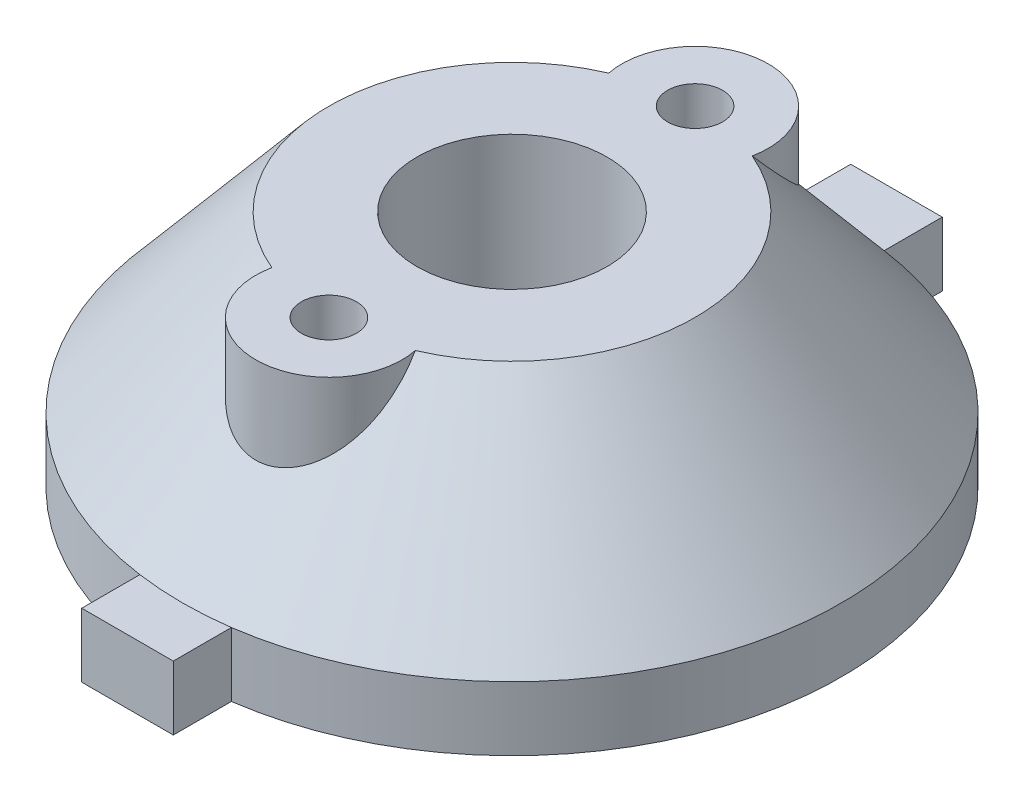
ISO-10303-21;
HEADER;
FILE_DESCRIPTION(('STEP AP214'),'2;1');
FILE_NAME('part.step','',(''),(''),'','','');
FILE_SCHEMA(('AUTOMOTIVE_DESIGN { 1 0 10303 214 1 1 1 1 }'));
ENDSEC;
DATA;
#1=APPLICATION_CONTEXT('core data for automotive mechanical design processes');
#2=APPLICATION_PROTOCOL_DEFINITION('international standard','automotive_design',2000,#1);
#3=PRODUCT_CONTEXT('',#1,'mechanical');
#4=PRODUCT('Part','Part','',(#3));
#5=PRODUCT_RELATED_PRODUCT_CATEGORY('part','',(#4));
#6=PRODUCT_DEFINITION_FORMATION('','',#4);
#7=PRODUCT_DEFINITION_CONTEXT('part definition',#1,'design');
#8=PRODUCT_DEFINITION('design','',#6,#7);
#9=PRODUCT_DEFINITION_SHAPE('','',#8);
#10=(LENGTH_UNIT() NAMED_UNIT(*) SI_UNIT(.MILLI.,.METRE.));
#11=(NAMED_UNIT(*) PLANE_ANGLE_UNIT() SI_UNIT($,.RADIAN.));
#12=(NAMED_UNIT(*) SI_UNIT($,.STERADIAN.) SOLID_ANGLE_UNIT());
#13=UNCERTAINTY_MEASURE_WITH_UNIT(LENGTH_MEASURE(1.E-05),#10,'distance_accuracy_value','');
#14=(GEOMETRIC_REPRESENTATION_CONTEXT(3) GLOBAL_UNCERTAINTY_ASSIGNED_CONTEXT((#13)) GLOBAL_UNIT_ASSIGNED_CONTEXT((#10,
#11,#12)) REPRESENTATION_CONTEXT('',''));
#15=CARTESIAN_POINT('',(0.,0.,0.));
#16=DIRECTION('',(0.,0.,1.));
#17=DIRECTION('',(1.,0.,0.));
#18=AXIS2_PLACEMENT_3D('',#15,#16,#17);
#19=CARTESIAN_POINT('',(0.,0.,0.));
#20=DIRECTION('',(0.,-1.,0.));
#21=DIRECTION('',(0.,0.,-1.));
#22=AXIS2_PLACEMENT_3D('',#19,#20,#21);
#23=CYLINDRICAL_SURFACE('',#22,18.);
#24=DIRECTION('',(0.,-1.,0.));
#25=VECTOR('',#24,1.);
#26=CARTESIAN_POINT('',(-2.5,0.,-17.8255434699759));
#27=LINE('',#26,#25);
#28=CARTESIAN_POINT('',(-2.5,0.,-17.8255434699759));
#29=VERTEX_POINT('',#28);
#30=CARTESIAN_POINT('',(-2.5,3.5,-17.8255434699759));
#31=VERTEX_POINT('',#30);
#32=EDGE_CURVE('E171',#29,#31,#27,.F.);
#33=ORIENTED_EDGE('',*,*,#32,.F.);
#34=CARTESIAN_POINT('',(0.,0.,0.));
#35=DIRECTION('',(0.,-1.,0.));
#36=DIRECTION('',(0.,0.,-1.));
#37=AXIS2_PLACEMENT_3D('',#34,#35,#36);
#38=CIRCLE('',#37,18.);
#39=CARTESIAN_POINT('',(-2.5,0.,17.8255434699759));
#40=VERTEX_POINT('',#39);
#41=EDGE_CURVE('E197',#40,#29,#38,.T.);
#42=ORIENTED_EDGE('',*,*,#41,.F.);
#43=DIRECTION('',(0.,-1.,0.));
#44=VECTOR('',#43,1.);
#45=CARTESIAN_POINT('',(-2.5,0.,17.8255434699759));
#46=LINE('',#45,#44);
#47=CARTESIAN_POINT('',(-2.5,3.5,17.8255434699759));
#48=VERTEX_POINT('',#47);
#49=EDGE_CURVE('E169',#48,#40,#46,.T.);
#50=ORIENTED_EDGE('',*,*,#49,.F.);
#51=CARTESIAN_POINT('',(0.,3.5,0.));
#52=DIRECTION('',(0.,-1.,0.));
#53=DIRECTION('',(0.,0.,-1.));
#54=AXIS2_PLACEMENT_3D('',#51,#52,#53);
#55=CIRCLE('',#54,18.);
#56=EDGE_CURVE('E243',#48,#31,#55,.T.);
#57=ORIENTED_EDGE('',*,*,#56,.T.);
#58=EDGE_LOOP('',(#33,#42,#50,#57));
#59=FACE_BOUND('',#58,.T.);
#60=ADVANCED_FACE('F35',(#59),#23,.T.);
#61=CARTESIAN_POINT('',(0.,13.,0.));
#62=DIRECTION('',(0.,1.,0.));
#63=DIRECTION('',(0.,0.,1.));
#64=AXIS2_PLACEMENT_3D('',#61,#62,#63);
#65=PLANE('',#64);
#66=CARTESIAN_POINT('',(0.,13.,10.));
#67=DIRECTION('',(0.,1.,0.));
#68=DIRECTION('',(0.,0.,-1.));
#69=AXIS2_PLACEMENT_3D('',#66,#67,#68);
#70=CIRCLE('',#69,1.5);
#71=CARTESIAN_POINT('',(0.,13.,8.5));
#72=VERTEX_POINT('',#71);
#73=EDGE_CURVE('E183',#72,#72,#70,.T.);
#74=ORIENTED_EDGE('',*,*,#73,.F.);
#75=EDGE_LOOP('',(#74));
#76=FACE_BOUND('',#75,.T.);
#77=CARTESIAN_POINT('',(0.,13.,-10.));
#78=DIRECTION('',(0.,1.,0.));
#79=DIRECTION('',(0.,0.,1.));
#80=AXIS2_PLACEMENT_3D('',#77,#78,#79);
#81=CIRCLE('',#80,1.5);
#82=CARTESIAN_POINT('',(0.,13.,-8.5));
#83=VERTEX_POINT('',#82);
#84=EDGE_CURVE('E191',#83,#83,#81,.T.);
#85=ORIENTED_EDGE('',*,*,#84,.F.);
#86=EDGE_LOOP('',(#85));
#87=FACE_BOUND('',#86,.T.);
#88=CARTESIAN_POINT('',(0.,13.,0.));
#89=DIRECTION('',(0.,1.,0.));
#90=DIRECTION('',(0.,0.,1.));
#91=AXIS2_PLACEMENT_3D('',#88,#89,#90);
#92=CIRCLE('',#91,5.19238519309489);
#93=CARTESIAN_POINT('',(0.,13.,5.19238519309489));
#94=VERTEX_POINT('',#93);
#95=EDGE_CURVE('E179',#94,#94,#92,.T.);
#96=ORIENTED_EDGE('',*,*,#95,.F.);
#97=EDGE_LOOP('',(#96));
#98=FACE_BOUND('',#97,.T.);
#99=CARTESIAN_POINT('',(0.,13.,0.));
#100=DIRECTION('',(0.,-1.,0.));
#101=DIRECTION('',(0.,0.,-1.));
#102=AXIS2_PLACEMENT_3D('',#99,#100,#101);
#103=CIRCLE('',#102,10.);
#104=CARTESIAN_POINT('',(-3.91918358845308,13.,9.2));
#105=VERTEX_POINT('',#104);
#106=CARTESIAN_POINT('',(-3.91918358845308,13.,-9.2));
#107=VERTEX_POINT('',#106);
#108=EDGE_CURVE('E203',#105,#107,#103,.T.);
#109=ORIENTED_EDGE('',*,*,#108,.F.);
#110=CARTESIAN_POINT('',(0.,13.,10.));
#111=DIRECTION('',(0.,1.,0.));
#112=DIRECTION('',(0.,0.,-1.));
#113=AXIS2_PLACEMENT_3D('',#110,#111,#112);
#114=CIRCLE('',#113,4.);
#115=CARTESIAN_POINT('',(3.91918358845308,13.,9.2));
#116=VERTEX_POINT('',#115);
#117=EDGE_CURVE('E188',#105,#116,#114,.T.);
#118=ORIENTED_EDGE('',*,*,#117,.T.);
#119=CARTESIAN_POINT('',(3.91918358845308,13.,-9.2));
#120=VERTEX_POINT('',#119);
#121=EDGE_CURVE('E205',#120,#116,#103,.T.);
#122=ORIENTED_EDGE('',*,*,#121,.F.);
#123=CARTESIAN_POINT('',(0.,13.,-10.));
#124=DIRECTION('',(0.,1.,0.));
#125=DIRECTION('',(0.,0.,1.));
#126=AXIS2_PLACEMENT_3D('',#123,#124,#125);
#127=CIRCLE('',#126,4.);
#128=EDGE_CURVE('E194',#120,#107,#127,.T.);
#129=ORIENTED_EDGE('',*,*,#128,.T.);
#130=EDGE_LOOP('',(#109,#118,#122,#129));
#131=FACE_BOUND('',#130,.T.);
#132=ADVANCED_FACE('F37',(#76,#87,#98,#131),#65,.T.);
#133=CARTESIAN_POINT('',(0.,3.5,0.));
#134=DIRECTION('',(0.,-1.,0.));
#135=DIRECTION('',(0.,0.,-1.));
#136=AXIS2_PLACEMENT_3D('',#133,#134,#135);
#137=CONICAL_SURFACE('',#136,18.,0.699892869719244);
#138=CARTESIAN_POINT('',(-3.91914920616961,13.0002,9.19983158036566));
#139=CARTESIAN_POINT('',(-3.95075923455144,12.8160826917739,9.35484774935974));
#140=CARTESIAN_POINT('',(-3.97346461662511,12.6328062628066,9.51281594223678));
#141=CARTESIAN_POINT('',(-3.99980240402056,12.268589800989,9.8337213347549));
#142=CARTESIAN_POINT('',(-4.00339458043925,12.0876554950604,9.99666828963129));
#143=CARTESIAN_POINT('',(-3.9900281867457,11.7276733584543,10.3276692278454));
#144=CARTESIAN_POINT('',(-3.97285250875532,11.5486655402407,10.4957589456478));
#145=CARTESIAN_POINT('',(-3.91595365293676,11.1960212987407,10.833427783479));
#146=CARTESIAN_POINT('',(-3.87625259219583,11.0223797825077,11.0030052821346));
#147=CARTESIAN_POINT('',(-3.75662698397835,10.6299465777407,11.393256192884));
#148=CARTESIAN_POINT('',(-3.66813748206792,10.4134991795126,11.6137715577348));
#149=CARTESIAN_POINT('',(-3.44541916363908,9.99757485410138,12.0464624718719));
#150=CARTESIAN_POINT('',(-3.31136302415467,9.7980373611375,12.2586661815325));
#151=CARTESIAN_POINT('',(-3.02853819048656,9.46352339642307,12.620771034298));
#152=CARTESIAN_POINT('',(-2.8895483314789,9.32401814645826,12.7740853390518));
#153=CARTESIAN_POINT('',(-2.58013517936633,9.06336515950528,13.0639419331389));
#154=CARTESIAN_POINT('',(-2.40973894899039,8.94220177989101,13.200498495057));
#155=CARTESIAN_POINT('',(-2.07454496334474,8.74512430661364,13.4246915020768));
#156=CARTESIAN_POINT('',(-1.91518451074698,8.66499555299191,13.5166711830348));
#157=CARTESIAN_POINT('',(-1.66283984130523,8.55887155890463,13.6391949229873));
#158=CARTESIAN_POINT('',(-1.57647741312468,8.5258333092794,13.6774717909999));
#159=CARTESIAN_POINT('',(-1.39972331379381,8.46484768833547,13.7483095984875));
#160=CARTESIAN_POINT('',(-1.30933342794783,8.43689808870681,13.7808730396332));
#161=CARTESIAN_POINT('',(-1.12433170041257,8.38627737591535,13.8399717058878));
#162=CARTESIAN_POINT('',(-1.02969247020207,8.36364904722242,13.8664580306094));
#163=CARTESIAN_POINT('',(-0.837594625726707,8.32431590690684,13.9125675450234));
#164=CARTESIAN_POINT('',(-0.740137421411839,8.30760818658521,13.9321941047421));
#165=CARTESIAN_POINT('',(-0.543211906859828,8.28038962123624,13.9641983952071));
#166=CARTESIAN_POINT('',(-0.443744176656824,8.26987701459124,13.9765781866087));
#167=CARTESIAN_POINT('',(-0.243698083298808,8.25523178790699,13.9938310337544));
#168=CARTESIAN_POINT('',(-0.143119857256524,8.25109838890706,13.9987050060287));
#169=CARTESIAN_POINT('',(0.04603418073018,8.24939357231949,14.0007149938418));
#170=CARTESIAN_POINT('',(0.134596089028336,8.25109155696998,13.9987125403984));
#171=CARTESIAN_POINT('',(0.311186837690387,8.25945325524702,13.988857652276));
#172=CARTESIAN_POINT('',(0.399215502085891,8.26611852670707,13.9810033823589));
#173=CARTESIAN_POINT('',(0.57402092085884,8.28432061628312,13.9595766260944));
#174=CARTESIAN_POINT('',(0.660798272800297,8.29585502370492,13.9460069694249));
#175=CARTESIAN_POINT('',(0.832558671879409,8.32363389374952,13.9133750067335));
#176=CARTESIAN_POINT('',(0.917541017113281,8.33988016357242,13.8943105932556));
#177=CARTESIAN_POINT('',(1.16620882074751,8.39478998427296,13.8299960149364));
#178=CARTESIAN_POINT('',(1.32661926532747,8.43994827875488,13.7772405403781));
#179=CARTESIAN_POINT('',(1.63502963220609,8.54572622223374,13.6543565862017));
#180=CARTESIAN_POINT('',(1.78302648348076,8.60634968228599,13.5842238244499));
#181=CARTESIAN_POINT('',(2.08075253095367,8.74852063654434,13.4208841812101));
#182=CARTESIAN_POINT('',(2.22877605310944,8.83166108790051,13.3259628080941));
#183=CARTESIAN_POINT('',(2.50591999157956,9.01150544875719,13.1224985169739));
#184=CARTESIAN_POINT('',(2.63502736061572,9.10821863076582,13.0139462921359));
#185=CARTESIAN_POINT('',(2.93721690280013,9.36661033490924,12.7269252504796));
#186=CARTESIAN_POINT('',(3.09765856952296,9.53568223783478,12.5417383865915));
#187=CARTESIAN_POINT('',(3.3762770383753,9.89252977024584,12.158065732057));
#188=CARTESIAN_POINT('',(3.49435807617712,10.0803465671418,11.959550998052));
#189=CARTESIAN_POINT('',(3.72627889162501,10.5382042244586,11.4855342634266));
#190=CARTESIAN_POINT('',(3.82397458280074,10.8139049934442,11.2075442121197));
#191=CARTESIAN_POINT('',(3.92337564777988,11.2390544236992,10.7921288595299));
#192=CARTESIAN_POINT('',(3.94865392424535,11.3828589608977,10.6537761792969));
#193=CARTESIAN_POINT('',(3.98446244218456,11.6736725916697,10.3785342068061));
#194=CARTESIAN_POINT('',(3.99499699778404,11.8206807350517,10.2416444981107));
#195=CARTESIAN_POINT('',(4.00271490460542,12.138576810716,9.9507002130268));
#196=CARTESIAN_POINT('',(3.99775364180485,12.3098510141355,9.79701733185192));
#197=CARTESIAN_POINT('',(3.97082560162892,12.6539094879056,9.494642178619));
#198=CARTESIAN_POINT('',(3.94894541501581,12.8266816529043,9.34592850524946));
#199=CARTESIAN_POINT('',(3.91914920616961,13.0002,9.19983158036566));
#200=B_SPLINE_CURVE_WITH_KNOTS('',3,(#138,#139,#140,#141,#142,#143,#144,#145,#146,#147,#148,
#149,#150,#151,#152,#153,#154,#155,#156,#157,#158,#159,#160,#161,#162,#163,#164,#165,#166,#167,
#168,#169,#170,#171,#172,#173,#174,#175,#176,#177,#178,#179,#180,#181,#182,#183,#184,#185,#186,
#187,#188,#189,#190,#191,#192,#193,#194,#195,#196,#197,#198,#199),.UNSPECIFIED.,.F.,.F.,(4,2,2,
2,2,2,2,2,2,2,2,2,2,2,2,2,2,2,2,2,2,2,2,2,2,2,2,2,2,2,4),(0.,0.728201494021865,1.4579350802022,
2.19536373594051,2.93206957960081,3.8930103246706,4.85034940115872,5.59637650600973,
6.34176374282988,6.94119324865365,7.2411028392019,7.54088078238313,7.84299236741608,
8.14495532347626,8.44683237307827,8.74867255776329,9.01414658652434,9.27970390793202,
9.54512990664379,9.81065784247409,10.3326871179678,10.8548451607556,11.4361986600401,
12.0179512747857,12.906024391355,13.7960927005026,14.9996733189436,15.6027144296298,
16.2055790489464,16.8953884653647,17.5816906281441),.UNSPECIFIED.);
#201=EDGE_CURVE('E11',#105,#116,#200,.T.);
#202=ORIENTED_EDGE('',*,*,#201,.F.);
#203=ORIENTED_EDGE('',*,*,#108,.T.);
#204=CARTESIAN_POINT('',(3.91914920616961,13.0002,-9.19983158036566));
#205=CARTESIAN_POINT('',(3.95075923455144,12.8160826917739,-9.35484774935974));
#206=CARTESIAN_POINT('',(3.97346461662511,12.6328062628066,-9.51281594223678));
#207=CARTESIAN_POINT('',(3.99980240402056,12.268589800989,-9.8337213347549));
#208=CARTESIAN_POINT('',(4.00339458043925,12.0876554950604,-9.99666828963129));
#209=CARTESIAN_POINT('',(3.9900281867457,11.7276733584543,-10.3276692278454));
#210=CARTESIAN_POINT('',(3.97285250875532,11.5486655402407,-10.4957589456478));
#211=CARTESIAN_POINT('',(3.91595365293676,11.1960212987407,-10.833427783479));
#212=CARTESIAN_POINT('',(3.87625259219583,11.0223797825077,-11.0030052821346));
#213=CARTESIAN_POINT('',(3.75662698397835,10.6299465777407,-11.393256192884));
#214=CARTESIAN_POINT('',(3.66813748206792,10.4134991795126,-11.6137715577348));
#215=CARTESIAN_POINT('',(3.44541916363908,9.99757485410138,-12.0464624718719));
#216=CARTESIAN_POINT('',(3.31136302415467,9.7980373611375,-12.2586661815325));
#217=CARTESIAN_POINT('',(3.02853819048656,9.46352339642307,-12.620771034298));
#218=CARTESIAN_POINT('',(2.8895483314789,9.32401814645826,-12.7740853390518));
#219=CARTESIAN_POINT('',(2.58013517936633,9.06336515950528,-13.0639419331389));
#220=CARTESIAN_POINT('',(2.40973894899039,8.94220177989101,-13.200498495057));
#221=CARTESIAN_POINT('',(2.07454496334474,8.74512430661364,-13.4246915020768));
#222=CARTESIAN_POINT('',(1.91518451074698,8.66499555299191,-13.5166711830348));
#223=CARTESIAN_POINT('',(1.66283984130523,8.55887155890463,-13.6391949229873));
#224=CARTESIAN_POINT('',(1.57647741312468,8.5258333092794,-13.6774717909999));
#225=CARTESIAN_POINT('',(1.39972331379381,8.46484768833547,-13.7483095984875));
#226=CARTESIAN_POINT('',(1.30933342794783,8.43689808870681,-13.7808730396332));
#227=CARTESIAN_POINT('',(1.12433170041257,8.38627737591535,-13.8399717058878));
#228=CARTESIAN_POINT('',(1.02969247020207,8.36364904722242,-13.8664580306094));
#229=CARTESIAN_POINT('',(0.837594625726707,8.32431590690684,-13.9125675450234));
#230=CARTESIAN_POINT('',(0.740137421411839,8.30760818658521,-13.9321941047421));
#231=CARTESIAN_POINT('',(0.543211906859828,8.28038962123624,-13.9641983952071));
#232=CARTESIAN_POINT('',(0.443744176656824,8.26987701459124,-13.9765781866087));
#233=CARTESIAN_POINT('',(0.243698083298808,8.25523178790699,-13.9938310337544));
#234=CARTESIAN_POINT('',(0.143119857256524,8.25109838890706,-13.9987050060287));
#235=CARTESIAN_POINT('',(-0.04603418073018,8.24939357231949,-14.0007149938418));
#236=CARTESIAN_POINT('',(-0.134596089028336,8.25109155696998,-13.9987125403984));
#237=CARTESIAN_POINT('',(-0.311186837690387,8.25945325524702,-13.988857652276));
#238=CARTESIAN_POINT('',(-0.399215502085891,8.26611852670707,-13.9810033823589));
#239=CARTESIAN_POINT('',(-0.57402092085884,8.28432061628312,-13.9595766260944));
#240=CARTESIAN_POINT('',(-0.660798272800297,8.29585502370492,-13.9460069694249));
#241=CARTESIAN_POINT('',(-0.832558671879409,8.32363389374952,-13.9133750067335));
#242=CARTESIAN_POINT('',(-0.917541017113281,8.33988016357242,-13.8943105932556));
#243=CARTESIAN_POINT('',(-1.16620882074751,8.39478998427296,-13.8299960149364));
#244=CARTESIAN_POINT('',(-1.32661926532747,8.43994827875488,-13.7772405403781));
#245=CARTESIAN_POINT('',(-1.63502963220609,8.54572622223374,-13.6543565862017));
#246=CARTESIAN_POINT('',(-1.78302648348076,8.60634968228599,-13.5842238244499));
#247=CARTESIAN_POINT('',(-2.08075253095367,8.74852063654434,-13.4208841812101));
#248=CARTESIAN_POINT('',(-2.22877605310944,8.83166108790051,-13.3259628080941));
#249=CARTESIAN_POINT('',(-2.50591999157956,9.01150544875719,-13.1224985169739));
#250=CARTESIAN_POINT('',(-2.63502736061572,9.10821863076582,-13.0139462921359));
#251=CARTESIAN_POINT('',(-2.93721690280013,9.36661033490924,-12.7269252504796));
#252=CARTESIAN_POINT('',(-3.09765856952296,9.53568223783478,-12.5417383865915));
#253=CARTESIAN_POINT('',(-3.3762770383753,9.89252977024584,-12.158065732057));
#254=CARTESIAN_POINT('',(-3.49435807617712,10.0803465671418,-11.959550998052));
#255=CARTESIAN_POINT('',(-3.72627889162501,10.5382042244586,-11.4855342634266));
#256=CARTESIAN_POINT('',(-3.82397458280074,10.8139049934442,-11.2075442121197));
#257=CARTESIAN_POINT('',(-3.92337564777988,11.2390544236992,-10.7921288595299));
#258=CARTESIAN_POINT('',(-3.94865392424535,11.3828589608977,-10.6537761792969));
#259=CARTESIAN_POINT('',(-3.98446244218456,11.6736725916697,-10.3785342068061));
#260=CARTESIAN_POINT('',(-3.99499699778404,11.8206807350517,-10.2416444981107));
#261=CARTESIAN_POINT('',(-4.00271490460542,12.138576810716,-9.9507002130268));
#262=CARTESIAN_POINT('',(-3.99775364180485,12.3098510141355,-9.79701733185192));
#263=CARTESIAN_POINT('',(-3.97082560162892,12.6539094879056,-9.494642178619));
#264=CARTESIAN_POINT('',(-3.94894541501581,12.8266816529043,-9.34592850524946));
#265=CARTESIAN_POINT('',(-3.91914920616961,13.0002,-9.19983158036566));
#266=B_SPLINE_CURVE_WITH_KNOTS('',3,(#204,#205,#206,#207,#208,#209,#210,#211,#212,#213,#214,
#215,#216,#217,#218,#219,#220,#221,#222,#223,#224,#225,#226,#227,#228,#229,#230,#231,#232,#233,
#234,#235,#236,#237,#238,#239,#240,#241,#242,#243,#244,#245,#246,#247,#248,#249,#250,#251,#252,
#253,#254,#255,#256,#257,#258,#259,#260,#261,#262,#263,#264,#265),.UNSPECIFIED.,.F.,.F.,(4,2,2,
2,2,2,2,2,2,2,2,2,2,2,2,2,2,2,2,2,2,2,2,2,2,2,2,2,2,2,4),(0.,0.728201494021865,1.4579350802022,
2.19536373594051,2.93206957960081,3.8930103246706,4.85034940115872,5.59637650600973,
6.34176374282988,6.94119324865365,7.2411028392019,7.54088078238313,7.84299236741608,
8.14495532347626,8.44683237307827,8.74867255776329,9.01414658652434,9.27970390793202,
9.54512990664379,9.81065784247409,10.3326871179678,10.8548451607556,11.4361986600401,
12.0179512747857,12.906024391355,13.7960927005026,14.9996733189436,15.6027144296298,
16.2055790489464,16.8953884653647,17.5816906281441),.UNSPECIFIED.);
#267=EDGE_CURVE('E47',#120,#107,#266,.T.);
#268=ORIENTED_EDGE('',*,*,#267,.F.);
#269=ORIENTED_EDGE('',*,*,#121,.T.);
#270=EDGE_LOOP('',(#202,#203,#268,#269));
#271=FACE_BOUND('',#270,.T.);
#272=CARTESIAN_POINT('',(2.5,3.5,-17.8255434699759));
#273=VERTEX_POINT('',#272);
#274=CARTESIAN_POINT('',(2.5,3.5,17.8255434699759));
#275=VERTEX_POINT('',#274);
#276=EDGE_CURVE('E200',#273,#275,#55,.T.);
#277=ORIENTED_EDGE('',*,*,#276,.F.);
#278=EDGE_CURVE('E134',#31,#273,#55,.T.);
#279=ORIENTED_EDGE('',*,*,#278,.F.);
#280=ORIENTED_EDGE('',*,*,#56,.F.);
#281=EDGE_CURVE('E204',#275,#48,#55,.T.);
#282=ORIENTED_EDGE('',*,*,#281,.F.);
#283=EDGE_LOOP('',(#277,#279,#280,#282));
#284=FACE_BOUND('',#283,.T.);
#285=ADVANCED_FACE('F211',(#271,#284),#137,.T.);
#286=DIRECTION('',(0.,-1.,0.));
#287=VECTOR('',#286,1.);
#288=CARTESIAN_POINT('',(2.5,0.,17.8255434699759));
#289=LINE('',#288,#287);
#290=CARTESIAN_POINT('',(2.5,0.,17.8255434699759));
#291=VERTEX_POINT('',#290);
#292=EDGE_CURVE('E167',#291,#275,#289,.F.);
#293=ORIENTED_EDGE('',*,*,#292,.F.);
#294=CARTESIAN_POINT('',(2.5,0.,-17.8255434699759));
#295=VERTEX_POINT('',#294);
#296=EDGE_CURVE('E198',#295,#291,#38,.T.);
#297=ORIENTED_EDGE('',*,*,#296,.F.);
#298=DIRECTION('',(0.,-1.,0.));
#299=VECTOR('',#298,1.);
#300=CARTESIAN_POINT('',(2.5,0.,-17.8255434699759));
#301=LINE('',#300,#299);
#302=EDGE_CURVE('E161',#273,#295,#301,.T.);
#303=ORIENTED_EDGE('',*,*,#302,.F.);
#304=ORIENTED_EDGE('',*,*,#276,.T.);
#305=EDGE_LOOP('',(#293,#297,#303,#304));
#306=FACE_BOUND('',#305,.T.);
#307=ADVANCED_FACE('F223',(#306),#23,.T.);
#308=CARTESIAN_POINT('',(0.,0.,0.));
#309=DIRECTION('',(0.,-1.,0.));
#310=DIRECTION('',(0.,0.,-1.));
#311=AXIS2_PLACEMENT_3D('',#308,#309,#310);
#312=PLANE('',#311);
#313=CARTESIAN_POINT('',(0.,0.,0.));
#314=DIRECTION('',(0.,-1.,0.));
#315=DIRECTION('',(0.,0.,-1.));
#316=AXIS2_PLACEMENT_3D('',#313,#314,#315);
#317=CIRCLE('',#316,1.5);
#318=CARTESIAN_POINT('',(0.,0.,-1.5));
#319=VERTEX_POINT('',#318);
#320=EDGE_CURVE('E146',#319,#319,#317,.T.);
#321=ORIENTED_EDGE('',*,*,#320,.F.);
#322=EDGE_LOOP('',(#321));
#323=FACE_BOUND('',#322,.T.);
#324=ORIENTED_EDGE('',*,*,#296,.T.);
#325=DIRECTION('',(0.,0.,1.));
#326=VECTOR('',#325,1.);
#327=CARTESIAN_POINT('',(2.5,0.,-21.));
#328=LINE('',#327,#326);
#329=CARTESIAN_POINT('',(2.5,0.,21.));
#330=VERTEX_POINT('',#329);
#331=EDGE_CURVE('E156',#291,#330,#328,.T.);
#332=ORIENTED_EDGE('',*,*,#331,.T.);
#333=DIRECTION('',(-1.,0.,0.));
#334=VECTOR('',#333,1.);
#335=CARTESIAN_POINT('',(-2.5,0.,21.));
#336=LINE('',#335,#334);
#337=CARTESIAN_POINT('',(-2.5,0.,21.));
#338=VERTEX_POINT('',#337);
#339=EDGE_CURVE('E158',#330,#338,#336,.T.);
#340=ORIENTED_EDGE('',*,*,#339,.T.);
#341=DIRECTION('',(0.,0.,-1.));
#342=VECTOR('',#341,1.);
#343=CARTESIAN_POINT('',(-2.5,0.,-21.));
#344=LINE('',#343,#342);
#345=EDGE_CURVE('E54',#338,#40,#344,.T.);
#346=ORIENTED_EDGE('',*,*,#345,.T.);
#347=ORIENTED_EDGE('',*,*,#41,.T.);
#348=CARTESIAN_POINT('',(-2.5,0.,-21.));
#349=VERTEX_POINT('',#348);
#350=EDGE_CURVE('E143',#29,#349,#344,.T.);
#351=ORIENTED_EDGE('',*,*,#350,.T.);
#352=DIRECTION('',(1.,0.,0.));
#353=VECTOR('',#352,1.);
#354=CARTESIAN_POINT('',(-2.5,0.,-21.));
#355=LINE('',#354,#353);
#356=CARTESIAN_POINT('',(2.5,0.,-21.));
#357=VERTEX_POINT('',#356);
#358=EDGE_CURVE('E154',#349,#357,#355,.T.);
#359=ORIENTED_EDGE('',*,*,#358,.T.);
#360=EDGE_CURVE('E61',#357,#295,#328,.T.);
#361=ORIENTED_EDGE('',*,*,#360,.T.);
#362=EDGE_LOOP('',(#324,#332,#340,#346,#347,#351,#359,#361));
#363=FACE_BOUND('',#362,.T.);
#364=ADVANCED_FACE('F220',(#323,#363),#312,.T.);
#365=CARTESIAN_POINT('',(0.,3.,-10.));
#366=DIRECTION('',(0.,1.,0.));
#367=DIRECTION('',(0.,0.,1.));
#368=AXIS2_PLACEMENT_3D('',#365,#366,#367);
#369=CYLINDRICAL_SURFACE('',#368,4.);
#370=ORIENTED_EDGE('',*,*,#128,.F.);
#371=ORIENTED_EDGE('',*,*,#267,.T.);
#372=EDGE_LOOP('',(#370,#371));
#373=FACE_BOUND('',#372,.T.);
#374=ADVANCED_FACE('F214',(#373),#369,.T.);
#375=CARTESIAN_POINT('',(0.,3.,-10.));
#376=DIRECTION('',(0.,1.,0.));
#377=DIRECTION('',(0.,0.,1.));
#378=AXIS2_PLACEMENT_3D('',#375,#376,#377);
#379=CYLINDRICAL_SURFACE('',#378,1.5);
#380=ORIENTED_EDGE('',*,*,#84,.T.);
#381=EDGE_LOOP('',(#380));
#382=FACE_BOUND('',#381,.T.);
#383=CARTESIAN_POINT('',(0.,5.,-10.));
#384=DIRECTION('',(0.,1.,0.));
#385=DIRECTION('',(0.,0.,1.));
#386=AXIS2_PLACEMENT_3D('',#383,#384,#385);
#387=CIRCLE('',#386,1.5);
#388=CARTESIAN_POINT('',(0.,5.,-8.5));
#389=VERTEX_POINT('',#388);
#390=EDGE_CURVE('E176',#389,#389,#387,.T.);
#391=ORIENTED_EDGE('',*,*,#390,.F.);
#392=EDGE_LOOP('',(#391));
#393=FACE_BOUND('',#392,.T.);
#394=ADVANCED_FACE('F219',(#382,#393),#379,.F.);
#395=CARTESIAN_POINT('',(0.,3.,10.));
#396=DIRECTION('',(0.,1.,0.));
#397=DIRECTION('',(0.,0.,1.));
#398=AXIS2_PLACEMENT_3D('',#395,#396,#397);
#399=CYLINDRICAL_SURFACE('',#398,4.);
#400=ORIENTED_EDGE('',*,*,#117,.F.);
#401=ORIENTED_EDGE('',*,*,#201,.T.);
#402=EDGE_LOOP('',(#400,#401));
#403=FACE_BOUND('',#402,.T.);
#404=ADVANCED_FACE('F319',(#403),#399,.T.);
#405=CARTESIAN_POINT('',(0.,3.,10.));
#406=DIRECTION('',(0.,1.,0.));
#407=DIRECTION('',(0.,0.,1.));
#408=AXIS2_PLACEMENT_3D('',#405,#406,#407);
#409=CYLINDRICAL_SURFACE('',#408,1.5);
#410=ORIENTED_EDGE('',*,*,#73,.T.);
#411=EDGE_LOOP('',(#410));
#412=FACE_BOUND('',#411,.T.);
#413=CARTESIAN_POINT('',(0.,5.,10.));
#414=DIRECTION('',(0.,1.,0.));
#415=DIRECTION('',(0.,0.,1.));
#416=AXIS2_PLACEMENT_3D('',#413,#414,#415);
#417=CIRCLE('',#416,1.5);
#418=CARTESIAN_POINT('',(0.,5.,11.5));
#419=VERTEX_POINT('',#418);
#420=EDGE_CURVE('E173',#419,#419,#417,.T.);
#421=ORIENTED_EDGE('',*,*,#420,.F.);
#422=EDGE_LOOP('',(#421));
#423=FACE_BOUND('',#422,.T.);
#424=ADVANCED_FACE('F308',(#412,#423),#409,.F.);
#425=CARTESIAN_POINT('',(0.,5.,0.));
#426=DIRECTION('',(0.,1.,0.));
#427=DIRECTION('',(0.,0.,1.));
#428=AXIS2_PLACEMENT_3D('',#425,#426,#427);
#429=CYLINDRICAL_SURFACE('',#428,5.19238519309489);
#430=CARTESIAN_POINT('',(0.,5.,0.));
#431=DIRECTION('',(0.,1.,0.));
#432=DIRECTION('',(0.,0.,1.));
#433=AXIS2_PLACEMENT_3D('',#430,#431,#432);
#434=CIRCLE('',#433,5.19238519309489);
#435=CARTESIAN_POINT('',(0.,5.,5.19238519309489));
#436=VERTEX_POINT('',#435);
#437=EDGE_CURVE('E180',#436,#436,#434,.T.);
#438=ORIENTED_EDGE('',*,*,#437,.F.);
#439=EDGE_LOOP('',(#438));
#440=FACE_BOUND('',#439,.T.);
#441=ORIENTED_EDGE('',*,*,#95,.T.);
#442=EDGE_LOOP('',(#441));
#443=FACE_BOUND('',#442,.T.);
#444=ADVANCED_FACE('F302',(#440,#443),#429,.F.);
#445=CARTESIAN_POINT('',(0.,5.,0.));
#446=DIRECTION('',(0.,1.,0.));
#447=DIRECTION('',(0.,0.,1.));
#448=AXIS2_PLACEMENT_3D('',#445,#446,#447);
#449=PLANE('',#448);
#450=CARTESIAN_POINT('',(0.,5.,0.));
#451=DIRECTION('',(0.,1.,0.));
#452=DIRECTION('',(0.,0.,1.));
#453=AXIS2_PLACEMENT_3D('',#450,#451,#452);
#454=CIRCLE('',#453,1.5);
#455=CARTESIAN_POINT('',(0.,5.,1.5));
#456=VERTEX_POINT('',#455);
#457=EDGE_CURVE('E296',#456,#456,#454,.T.);
#458=ORIENTED_EDGE('',*,*,#457,.F.);
#459=EDGE_LOOP('',(#458));
#460=FACE_BOUND('',#459,.T.);
#461=ORIENTED_EDGE('',*,*,#437,.T.);
#462=EDGE_LOOP('',(#461));
#463=FACE_BOUND('',#462,.T.);
#464=ADVANCED_FACE('F298',(#460,#463),#449,.T.);
#465=CARTESIAN_POINT('',(0.,5.,-10.));
#466=DIRECTION('',(0.,1.,0.));
#467=DIRECTION('',(0.,0.,1.));
#468=AXIS2_PLACEMENT_3D('',#465,#466,#467);
#469=PLANE('',#468);
#470=ORIENTED_EDGE('',*,*,#390,.T.);
#471=EDGE_LOOP('',(#470));
#472=FACE_BOUND('',#471,.T.);
#473=ADVANCED_FACE('F301',(#472),#469,.T.);
#474=CARTESIAN_POINT('',(0.,5.,10.));
#475=DIRECTION('',(0.,1.,0.));
#476=DIRECTION('',(0.,0.,1.));
#477=AXIS2_PLACEMENT_3D('',#474,#475,#476);
#478=PLANE('',#477);
#479=ORIENTED_EDGE('',*,*,#420,.T.);
#480=EDGE_LOOP('',(#479));
#481=FACE_BOUND('',#480,.T.);
#482=ADVANCED_FACE('F281',(#481),#478,.T.);
#483=CARTESIAN_POINT('',(-2.5,3.5,-21.));
#484=DIRECTION('',(0.,0.,-1.));
#485=DIRECTION('',(-1.,0.,0.));
#486=AXIS2_PLACEMENT_3D('',#483,#484,#485);
#487=PLANE('',#486);
#488=ORIENTED_EDGE('',*,*,#358,.F.);
#489=DIRECTION('',(0.,-1.,0.));
#490=VECTOR('',#489,1.);
#491=CARTESIAN_POINT('',(-2.5,3.5,-21.));
#492=LINE('',#491,#490);
#493=CARTESIAN_POINT('',(-2.5,3.5,-21.));
#494=VERTEX_POINT('',#493);
#495=EDGE_CURVE('E141',#494,#349,#492,.T.);
#496=ORIENTED_EDGE('',*,*,#495,.F.);
#497=DIRECTION('',(1.,0.,0.));
#498=VECTOR('',#497,1.);
#499=CARTESIAN_POINT('',(-2.5,3.5,-21.));
#500=LINE('',#499,#498);
#501=CARTESIAN_POINT('',(2.5,3.5,-21.));
#502=VERTEX_POINT('',#501);
#503=EDGE_CURVE('E132',#494,#502,#500,.T.);
#504=ORIENTED_EDGE('',*,*,#503,.T.);
#505=DIRECTION('',(0.,-1.,0.));
#506=VECTOR('',#505,1.);
#507=CARTESIAN_POINT('',(2.5,3.5,-21.));
#508=LINE('',#507,#506);
#509=EDGE_CURVE('E117',#502,#357,#508,.T.);
#510=ORIENTED_EDGE('',*,*,#509,.T.);
#511=EDGE_LOOP('',(#488,#496,#504,#510));
#512=FACE_BOUND('',#511,.T.);
#513=ADVANCED_FACE('F139',(#512),#487,.T.);
#514=CARTESIAN_POINT('',(0.,3.5,0.));
#515=DIRECTION('',(0.,-1.,0.));
#516=DIRECTION('',(0.,0.,-1.));
#517=AXIS2_PLACEMENT_3D('',#514,#515,#516);
#518=PLANE('',#517);
#519=ORIENTED_EDGE('',*,*,#278,.T.);
#520=DIRECTION('',(0.,0.,1.));
#521=VECTOR('',#520,1.);
#522=CARTESIAN_POINT('',(2.5,3.5,-21.));
#523=LINE('',#522,#521);
#524=EDGE_CURVE('E120',#502,#273,#523,.T.);
#525=ORIENTED_EDGE('',*,*,#524,.F.);
#526=ORIENTED_EDGE('',*,*,#503,.F.);
#527=DIRECTION('',(0.,0.,-1.));
#528=VECTOR('',#527,1.);
#529=CARTESIAN_POINT('',(-2.5,3.5,-21.));
#530=LINE('',#529,#528);
#531=EDGE_CURVE('E151',#31,#494,#530,.T.);
#532=ORIENTED_EDGE('',*,*,#531,.F.);
#533=EDGE_LOOP('',(#519,#525,#526,#532));
#534=FACE_BOUND('',#533,.T.);
#535=ADVANCED_FACE('F130',(#534),#518,.F.);
#536=CARTESIAN_POINT('',(2.5,3.5,-21.));
#537=DIRECTION('',(1.,0.,0.));
#538=DIRECTION('',(0.,0.,-1.));
#539=AXIS2_PLACEMENT_3D('',#536,#537,#538);
#540=PLANE('',#539);
#541=ORIENTED_EDGE('',*,*,#524,.T.);
#542=ORIENTED_EDGE('',*,*,#302,.T.);
#543=ORIENTED_EDGE('',*,*,#360,.F.);
#544=ORIENTED_EDGE('',*,*,#509,.F.);
#545=EDGE_LOOP('',(#541,#542,#543,#544));
#546=FACE_BOUND('',#545,.T.);
#547=ADVANCED_FACE('F119',(#546),#540,.T.);
#548=CARTESIAN_POINT('',(-2.5,3.5,-21.));
#549=DIRECTION('',(-1.,0.,0.));
#550=DIRECTION('',(0.,0.,1.));
#551=AXIS2_PLACEMENT_3D('',#548,#549,#550);
#552=PLANE('',#551);
#553=ORIENTED_EDGE('',*,*,#350,.F.);
#554=ORIENTED_EDGE('',*,*,#32,.T.);
#555=ORIENTED_EDGE('',*,*,#531,.T.);
#556=ORIENTED_EDGE('',*,*,#495,.T.);
#557=EDGE_LOOP('',(#553,#554,#555,#556));
#558=FACE_BOUND('',#557,.T.);
#559=ADVANCED_FACE('F245',(#558),#552,.T.);
#560=ORIENTED_EDGE('',*,*,#281,.T.);
#561=CARTESIAN_POINT('',(-2.5,3.5,21.));
#562=VERTEX_POINT('',#561);
#563=EDGE_CURVE('E126',#562,#48,#530,.T.);
#564=ORIENTED_EDGE('',*,*,#563,.F.);
#565=DIRECTION('',(-1.,0.,0.));
#566=VECTOR('',#565,1.);
#567=CARTESIAN_POINT('',(-2.5,3.5,21.));
#568=LINE('',#567,#566);
#569=CARTESIAN_POINT('',(2.5,3.5,21.));
#570=VERTEX_POINT('',#569);
#571=EDGE_CURVE('E135',#570,#562,#568,.T.);
#572=ORIENTED_EDGE('',*,*,#571,.F.);
#573=EDGE_CURVE('E136',#275,#570,#523,.T.);
#574=ORIENTED_EDGE('',*,*,#573,.F.);
#575=EDGE_LOOP('',(#560,#564,#572,#574));
#576=FACE_BOUND('',#575,.T.);
#577=ADVANCED_FACE('F252',(#576),#518,.F.);
#578=ORIENTED_EDGE('',*,*,#331,.F.);
#579=ORIENTED_EDGE('',*,*,#292,.T.);
#580=ORIENTED_EDGE('',*,*,#573,.T.);
#581=DIRECTION('',(0.,-1.,0.));
#582=VECTOR('',#581,1.);
#583=CARTESIAN_POINT('',(2.5,3.5,21.));
#584=LINE('',#583,#582);
#585=EDGE_CURVE('E125',#570,#330,#584,.T.);
#586=ORIENTED_EDGE('',*,*,#585,.T.);
#587=EDGE_LOOP('',(#578,#579,#580,#586));
#588=FACE_BOUND('',#587,.T.);
#589=ADVANCED_FACE('F261',(#588),#540,.T.);
#590=ORIENTED_EDGE('',*,*,#563,.T.);
#591=ORIENTED_EDGE('',*,*,#49,.T.);
#592=ORIENTED_EDGE('',*,*,#345,.F.);
#593=DIRECTION('',(0.,-1.,0.));
#594=VECTOR('',#593,1.);
#595=CARTESIAN_POINT('',(-2.5,3.5,21.));
#596=LINE('',#595,#594);
#597=EDGE_CURVE('E162',#562,#338,#596,.T.);
#598=ORIENTED_EDGE('',*,*,#597,.F.);
#599=EDGE_LOOP('',(#590,#591,#592,#598));
#600=FACE_BOUND('',#599,.T.);
#601=ADVANCED_FACE('F255',(#600),#552,.T.);
#602=CARTESIAN_POINT('',(-2.5,3.5,21.));
#603=DIRECTION('',(0.,0.,1.));
#604=DIRECTION('',(1.,0.,0.));
#605=AXIS2_PLACEMENT_3D('',#602,#603,#604);
#606=PLANE('',#605);
#607=ORIENTED_EDGE('',*,*,#339,.F.);
#608=ORIENTED_EDGE('',*,*,#585,.F.);
#609=ORIENTED_EDGE('',*,*,#571,.T.);
#610=ORIENTED_EDGE('',*,*,#597,.T.);
#611=EDGE_LOOP('',(#607,#608,#609,#610));
#612=FACE_BOUND('',#611,.T.);
#613=ADVANCED_FACE('F259',(#612),#606,.T.);
#614=CARTESIAN_POINT('',(0.,-41.0130159807723,0.));
#615=DIRECTION('',(0.,1.,0.));
#616=DIRECTION('',(0.,0.,1.));
#617=AXIS2_PLACEMENT_3D('',#614,#615,#616);
#618=CYLINDRICAL_SURFACE('',#617,1.5);
#619=ORIENTED_EDGE('',*,*,#320,.T.);
#620=EDGE_LOOP('',(#619));
#621=FACE_BOUND('',#620,.T.);
#622=ORIENTED_EDGE('',*,*,#457,.T.);
#623=EDGE_LOOP('',(#622));
#624=FACE_BOUND('',#623,.T.);
#625=ADVANCED_FACE('F283',(#621,#624),#618,.F.);
#626=CLOSED_SHELL('',(#60,#132,#285,#307,#364,#374,#394,#404,#424,#444,#464,#473,#482,#513,#535,
#547,#559,#577,#589,#601,#613,#625));
#627=MANIFOLD_SOLID_BREP('B2',#626);
#628=ADVANCED_BREP_SHAPE_REPRESENTATION('',(#18,#627),#14);
#629=SHAPE_DEFINITION_REPRESENTATION(#9,#628);
ENDSEC;
END-ISO-10303-21;
